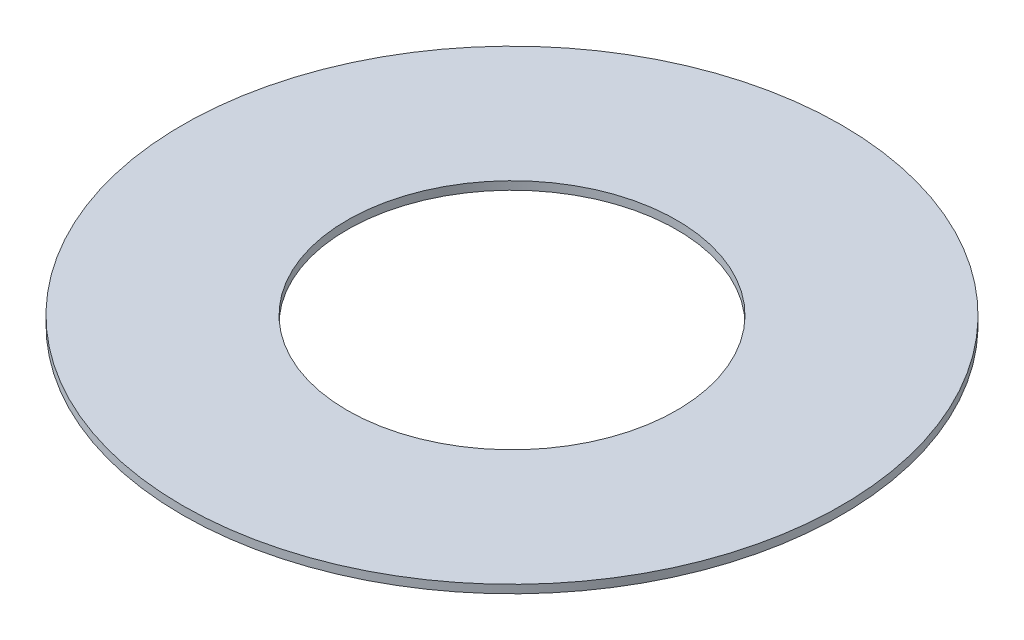
ISO-10303-21;
HEADER;
FILE_DESCRIPTION(('STEP AP214'),'2;1');
FILE_NAME('part.step','',(''),(''),'','','');
FILE_SCHEMA(('AUTOMOTIVE_DESIGN { 1 0 10303 214 1 1 1 1 }'));
ENDSEC;
DATA;
#1=APPLICATION_CONTEXT('core data for automotive mechanical design processes');
#2=APPLICATION_PROTOCOL_DEFINITION('international standard','automotive_design',2000,#1);
#3=PRODUCT_CONTEXT('',#1,'mechanical');
#4=PRODUCT('Part','Part','',(#3));
#5=PRODUCT_RELATED_PRODUCT_CATEGORY('part','',(#4));
#6=PRODUCT_DEFINITION_FORMATION('','',#4);
#7=PRODUCT_DEFINITION_CONTEXT('part definition',#1,'design');
#8=PRODUCT_DEFINITION('design','',#6,#7);
#9=PRODUCT_DEFINITION_SHAPE('','',#8);
#10=(LENGTH_UNIT() NAMED_UNIT(*) SI_UNIT(.MILLI.,.METRE.));
#11=(NAMED_UNIT(*) PLANE_ANGLE_UNIT() SI_UNIT($,.RADIAN.));
#12=(NAMED_UNIT(*) SI_UNIT($,.STERADIAN.) SOLID_ANGLE_UNIT());
#13=UNCERTAINTY_MEASURE_WITH_UNIT(LENGTH_MEASURE(1.E-05),#10,'distance_accuracy_value','');
#14=(GEOMETRIC_REPRESENTATION_CONTEXT(3) GLOBAL_UNCERTAINTY_ASSIGNED_CONTEXT((#13)) GLOBAL_UNIT_ASSIGNED_CONTEXT((#10,
#11,#12)) REPRESENTATION_CONTEXT('',''));
#15=CARTESIAN_POINT('',(0.,0.,0.));
#16=DIRECTION('',(0.,0.,1.));
#17=DIRECTION('',(1.,0.,0.));
#18=AXIS2_PLACEMENT_3D('',#15,#16,#17);
#19=CARTESIAN_POINT('',(0.,0.05,0.));
#20=DIRECTION('',(0.,1.,0.));
#21=DIRECTION('',(0.,0.,1.));
#22=AXIS2_PLACEMENT_3D('',#19,#20,#21);
#23=PLANE('',#22);
#24=CARTESIAN_POINT('',(0.,0.05,0.));
#25=DIRECTION('',(0.,1.,0.));
#26=DIRECTION('',(0.,0.,1.));
#27=AXIS2_PLACEMENT_3D('',#24,#25,#26);
#28=CIRCLE('',#27,4.);
#29=CARTESIAN_POINT('',(0.,0.05,4.));
#30=VERTEX_POINT('',#29);
#31=EDGE_CURVE('E10',#30,#30,#28,.T.);
#32=ORIENTED_EDGE('',*,*,#31,.T.);
#33=EDGE_LOOP('',(#32));
#34=FACE_BOUND('',#33,.T.);
#35=CARTESIAN_POINT('',(0.,0.05,0.));
#36=DIRECTION('',(0.,1.,0.));
#37=DIRECTION('',(0.,0.,1.));
#38=AXIS2_PLACEMENT_3D('',#35,#36,#37);
#39=CIRCLE('',#38,2.);
#40=CARTESIAN_POINT('',(0.,0.05,2.));
#41=VERTEX_POINT('',#40);
#42=EDGE_CURVE('E41',#41,#41,#39,.T.);
#43=ORIENTED_EDGE('',*,*,#42,.F.);
#44=EDGE_LOOP('',(#43));
#45=FACE_BOUND('',#44,.T.);
#46=ADVANCED_FACE('F34',(#34,#45),#23,.T.);
#47=CARTESIAN_POINT('',(0.,0.05,0.));
#48=DIRECTION('',(0.,-1.,0.));
#49=DIRECTION('',(0.,0.,-1.));
#50=AXIS2_PLACEMENT_3D('',#47,#48,#49);
#51=CYLINDRICAL_SURFACE('',#50,4.);
#52=ORIENTED_EDGE('',*,*,#31,.F.);
#53=EDGE_LOOP('',(#52));
#54=FACE_BOUND('',#53,.T.);
#55=CARTESIAN_POINT('',(0.,-0.05,0.));
#56=DIRECTION('',(0.,1.,0.));
#57=DIRECTION('',(0.,0.,1.));
#58=AXIS2_PLACEMENT_3D('',#55,#56,#57);
#59=CIRCLE('',#58,4.);
#60=CARTESIAN_POINT('',(0.,-0.05,4.));
#61=VERTEX_POINT('',#60);
#62=EDGE_CURVE('E45',#61,#61,#59,.T.);
#63=ORIENTED_EDGE('',*,*,#62,.T.);
#64=EDGE_LOOP('',(#63));
#65=FACE_BOUND('',#64,.T.);
#66=ADVANCED_FACE('F36',(#54,#65),#51,.T.);
#67=CARTESIAN_POINT('',(0.,0.05,0.));
#68=DIRECTION('',(0.,-1.,0.));
#69=DIRECTION('',(0.,0.,-1.));
#70=AXIS2_PLACEMENT_3D('',#67,#68,#69);
#71=CYLINDRICAL_SURFACE('',#70,2.);
#72=ORIENTED_EDGE('',*,*,#42,.T.);
#73=EDGE_LOOP('',(#72));
#74=FACE_BOUND('',#73,.T.);
#75=CARTESIAN_POINT('',(0.,-0.05,0.));
#76=DIRECTION('',(0.,1.,0.));
#77=DIRECTION('',(0.,0.,1.));
#78=AXIS2_PLACEMENT_3D('',#75,#76,#77);
#79=CIRCLE('',#78,2.);
#80=CARTESIAN_POINT('',(0.,-0.05,2.));
#81=VERTEX_POINT('',#80);
#82=EDGE_CURVE('E49',#81,#81,#79,.T.);
#83=ORIENTED_EDGE('',*,*,#82,.F.);
#84=EDGE_LOOP('',(#83));
#85=FACE_BOUND('',#84,.T.);
#86=ADVANCED_FACE('F58',(#74,#85),#71,.F.);
#87=CARTESIAN_POINT('',(0.,-0.05,0.));
#88=DIRECTION('',(0.,1.,0.));
#89=DIRECTION('',(0.,0.,1.));
#90=AXIS2_PLACEMENT_3D('',#87,#88,#89);
#91=PLANE('',#90);
#92=ORIENTED_EDGE('',*,*,#82,.T.);
#93=EDGE_LOOP('',(#92));
#94=FACE_BOUND('',#93,.T.);
#95=ORIENTED_EDGE('',*,*,#62,.F.);
#96=EDGE_LOOP('',(#95));
#97=FACE_BOUND('',#96,.T.);
#98=ADVANCED_FACE('F55',(#94,#97),#91,.F.);
#99=CLOSED_SHELL('',(#46,#66,#86,#98));
#100=MANIFOLD_SOLID_BREP('B2',#99);
#101=ADVANCED_BREP_SHAPE_REPRESENTATION('',(#18,#100),#14);
#102=SHAPE_DEFINITION_REPRESENTATION(#9,#101);
ENDSEC;
END-ISO-10303-21;
